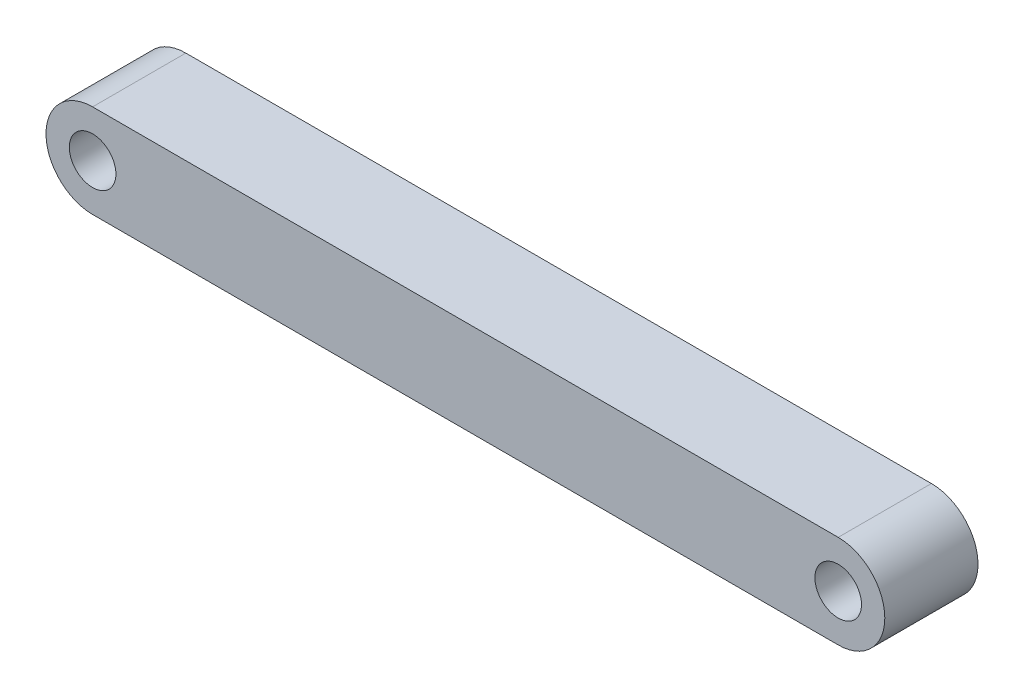
ISO-10303-21;
HEADER;
FILE_DESCRIPTION(('STEP AP214'),'2;1');
FILE_NAME('part.step','',(''),(''),'','','');
FILE_SCHEMA(('AUTOMOTIVE_DESIGN { 1 0 10303 214 1 1 1 1 }'));
ENDSEC;
DATA;
#1=APPLICATION_CONTEXT('core data for automotive mechanical design processes');
#2=APPLICATION_PROTOCOL_DEFINITION('international standard','automotive_design',2000,#1);
#3=PRODUCT_CONTEXT('',#1,'mechanical');
#4=PRODUCT('Part','Part','',(#3));
#5=PRODUCT_RELATED_PRODUCT_CATEGORY('part','',(#4));
#6=PRODUCT_DEFINITION_FORMATION('','',#4);
#7=PRODUCT_DEFINITION_CONTEXT('part definition',#1,'design');
#8=PRODUCT_DEFINITION('design','',#6,#7);
#9=PRODUCT_DEFINITION_SHAPE('','',#8);
#10=(LENGTH_UNIT() NAMED_UNIT(*) SI_UNIT(.MILLI.,.METRE.));
#11=(NAMED_UNIT(*) PLANE_ANGLE_UNIT() SI_UNIT($,.RADIAN.));
#12=(NAMED_UNIT(*) SI_UNIT($,.STERADIAN.) SOLID_ANGLE_UNIT());
#13=UNCERTAINTY_MEASURE_WITH_UNIT(LENGTH_MEASURE(1.E-05),#10,'distance_accuracy_value','');
#14=(GEOMETRIC_REPRESENTATION_CONTEXT(3) GLOBAL_UNCERTAINTY_ASSIGNED_CONTEXT((#13)) GLOBAL_UNIT_ASSIGNED_CONTEXT((#10,
#11,#12)) REPRESENTATION_CONTEXT('',''));
#15=CARTESIAN_POINT('',(0.,0.,0.));
#16=DIRECTION('',(0.,0.,1.));
#17=DIRECTION('',(1.,0.,0.));
#18=AXIS2_PLACEMENT_3D('',#15,#16,#17);
#19=CARTESIAN_POINT('',(-40.,0.,10.));
#20=DIRECTION('',(0.,0.,-1.));
#21=DIRECTION('',(-1.,0.,0.));
#22=AXIS2_PLACEMENT_3D('',#19,#20,#21);
#23=CYLINDRICAL_SURFACE('',#22,5.);
#24=CARTESIAN_POINT('',(-40.,0.,0.));
#25=DIRECTION('',(0.,0.,1.));
#26=DIRECTION('',(1.,0.,0.));
#27=AXIS2_PLACEMENT_3D('',#24,#25,#26);
#28=CIRCLE('',#27,5.);
#29=CARTESIAN_POINT('',(-40.,5.,0.));
#30=VERTEX_POINT('',#29);
#31=CARTESIAN_POINT('',(-40.,-5.,0.));
#32=VERTEX_POINT('',#31);
#33=EDGE_CURVE('E102',#30,#32,#28,.T.);
#34=ORIENTED_EDGE('',*,*,#33,.T.);
#35=DIRECTION('',(0.,0.,-1.));
#36=VECTOR('',#35,1.);
#37=CARTESIAN_POINT('',(-40.,-5.,10.));
#38=LINE('',#37,#36);
#39=CARTESIAN_POINT('',(-40.,-5.,10.));
#40=VERTEX_POINT('',#39);
#41=EDGE_CURVE('E11',#40,#32,#38,.T.);
#42=ORIENTED_EDGE('',*,*,#41,.F.);
#43=CARTESIAN_POINT('',(-40.,0.,10.));
#44=DIRECTION('',(0.,0.,1.));
#45=DIRECTION('',(1.,0.,0.));
#46=AXIS2_PLACEMENT_3D('',#43,#44,#45);
#47=CIRCLE('',#46,5.);
#48=CARTESIAN_POINT('',(-40.,5.,10.));
#49=VERTEX_POINT('',#48);
#50=EDGE_CURVE('E90',#49,#40,#47,.T.);
#51=ORIENTED_EDGE('',*,*,#50,.F.);
#52=DIRECTION('',(0.,0.,-1.));
#53=VECTOR('',#52,1.);
#54=CARTESIAN_POINT('',(-40.,5.,10.));
#55=LINE('',#54,#53);
#56=EDGE_CURVE('E98',#49,#30,#55,.T.);
#57=ORIENTED_EDGE('',*,*,#56,.T.);
#58=EDGE_LOOP('',(#34,#42,#51,#57));
#59=FACE_BOUND('',#58,.T.);
#60=ADVANCED_FACE('F39',(#59),#23,.T.);
#61=CARTESIAN_POINT('',(-40.,-5.,10.));
#62=DIRECTION('',(0.,1.,0.));
#63=DIRECTION('',(-1.,0.,0.));
#64=AXIS2_PLACEMENT_3D('',#61,#62,#63);
#65=PLANE('',#64);
#66=DIRECTION('',(1.,0.,0.));
#67=VECTOR('',#66,1.);
#68=CARTESIAN_POINT('',(-40.,-5.,0.));
#69=LINE('',#68,#67);
#70=CARTESIAN_POINT('',(40.,-4.99999999999999,0.));
#71=VERTEX_POINT('',#70);
#72=EDGE_CURVE('E94',#32,#71,#69,.T.);
#73=ORIENTED_EDGE('',*,*,#72,.T.);
#74=DIRECTION('',(0.,0.,-1.));
#75=VECTOR('',#74,1.);
#76=CARTESIAN_POINT('',(40.,-4.99999999999999,10.));
#77=LINE('',#76,#75);
#78=CARTESIAN_POINT('',(40.,-4.99999999999999,10.));
#79=VERTEX_POINT('',#78);
#80=EDGE_CURVE('E47',#79,#71,#77,.T.);
#81=ORIENTED_EDGE('',*,*,#80,.F.);
#82=DIRECTION('',(1.,0.,0.));
#83=VECTOR('',#82,1.);
#84=CARTESIAN_POINT('',(-40.,-5.,10.));
#85=LINE('',#84,#83);
#86=EDGE_CURVE('E85',#40,#79,#85,.T.);
#87=ORIENTED_EDGE('',*,*,#86,.F.);
#88=ORIENTED_EDGE('',*,*,#41,.T.);
#89=EDGE_LOOP('',(#73,#81,#87,#88));
#90=FACE_BOUND('',#89,.T.);
#91=ADVANCED_FACE('F93',(#90),#65,.F.);
#92=CARTESIAN_POINT('',(40.,0.,10.));
#93=DIRECTION('',(0.,0.,-1.));
#94=DIRECTION('',(-1.,0.,0.));
#95=AXIS2_PLACEMENT_3D('',#92,#93,#94);
#96=CYLINDRICAL_SURFACE('',#95,5.);
#97=CARTESIAN_POINT('',(40.,0.,0.));
#98=DIRECTION('',(0.,0.,1.));
#99=DIRECTION('',(1.,0.,0.));
#100=AXIS2_PLACEMENT_3D('',#97,#98,#99);
#101=CIRCLE('',#100,5.);
#102=CARTESIAN_POINT('',(40.,5.00000000000002,0.));
#103=VERTEX_POINT('',#102);
#104=EDGE_CURVE('E72',#71,#103,#101,.T.);
#105=ORIENTED_EDGE('',*,*,#104,.T.);
#106=DIRECTION('',(0.,0.,-1.));
#107=VECTOR('',#106,1.);
#108=CARTESIAN_POINT('',(40.,5.00000000000002,10.));
#109=LINE('',#108,#107);
#110=CARTESIAN_POINT('',(40.,5.00000000000002,10.));
#111=VERTEX_POINT('',#110);
#112=EDGE_CURVE('E95',#111,#103,#109,.T.);
#113=ORIENTED_EDGE('',*,*,#112,.F.);
#114=CARTESIAN_POINT('',(40.,0.,10.));
#115=DIRECTION('',(0.,0.,1.));
#116=DIRECTION('',(1.,0.,0.));
#117=AXIS2_PLACEMENT_3D('',#114,#115,#116);
#118=CIRCLE('',#117,5.);
#119=EDGE_CURVE('E88',#79,#111,#118,.T.);
#120=ORIENTED_EDGE('',*,*,#119,.F.);
#121=ORIENTED_EDGE('',*,*,#80,.T.);
#122=EDGE_LOOP('',(#105,#113,#120,#121));
#123=FACE_BOUND('',#122,.T.);
#124=ADVANCED_FACE('F96',(#123),#96,.T.);
#125=CARTESIAN_POINT('',(-40.,5.,10.));
#126=DIRECTION('',(0.,-1.,0.));
#127=DIRECTION('',(1.,0.,0.));
#128=AXIS2_PLACEMENT_3D('',#125,#126,#127);
#129=PLANE('',#128);
#130=DIRECTION('',(-1.,0.,0.));
#131=VECTOR('',#130,1.);
#132=CARTESIAN_POINT('',(-40.,5.,0.));
#133=LINE('',#132,#131);
#134=EDGE_CURVE('E78',#103,#30,#133,.T.);
#135=ORIENTED_EDGE('',*,*,#134,.T.);
#136=ORIENTED_EDGE('',*,*,#56,.F.);
#137=DIRECTION('',(-1.,0.,0.));
#138=VECTOR('',#137,1.);
#139=CARTESIAN_POINT('',(-40.,5.,10.));
#140=LINE('',#139,#138);
#141=EDGE_CURVE('E55',#111,#49,#140,.T.);
#142=ORIENTED_EDGE('',*,*,#141,.F.);
#143=ORIENTED_EDGE('',*,*,#112,.T.);
#144=EDGE_LOOP('',(#135,#136,#142,#143));
#145=FACE_BOUND('',#144,.T.);
#146=ADVANCED_FACE('F110',(#145),#129,.F.);
#147=CARTESIAN_POINT('',(-40.,0.,10.));
#148=DIRECTION('',(0.,0.,1.));
#149=DIRECTION('',(1.,0.,0.));
#150=AXIS2_PLACEMENT_3D('',#147,#148,#149);
#151=PLANE('',#150);
#152=CARTESIAN_POINT('',(-40.,0.,10.));
#153=DIRECTION('',(0.,0.,1.));
#154=DIRECTION('',(1.,0.,0.));
#155=AXIS2_PLACEMENT_3D('',#152,#153,#154);
#156=CIRCLE('',#155,2.5);
#157=CARTESIAN_POINT('',(-37.5,0.,10.));
#158=VERTEX_POINT('',#157);
#159=EDGE_CURVE('E122',#158,#158,#156,.T.);
#160=ORIENTED_EDGE('',*,*,#159,.F.);
#161=EDGE_LOOP('',(#160));
#162=FACE_BOUND('',#161,.T.);
#163=CARTESIAN_POINT('',(40.,0.,10.));
#164=DIRECTION('',(0.,0.,1.));
#165=DIRECTION('',(1.,0.,0.));
#166=AXIS2_PLACEMENT_3D('',#163,#164,#165);
#167=CIRCLE('',#166,2.5);
#168=CARTESIAN_POINT('',(42.5,0.,10.));
#169=VERTEX_POINT('',#168);
#170=EDGE_CURVE('E119',#169,#169,#167,.T.);
#171=ORIENTED_EDGE('',*,*,#170,.F.);
#172=EDGE_LOOP('',(#171));
#173=FACE_BOUND('',#172,.T.);
#174=ORIENTED_EDGE('',*,*,#50,.T.);
#175=ORIENTED_EDGE('',*,*,#86,.T.);
#176=ORIENTED_EDGE('',*,*,#119,.T.);
#177=ORIENTED_EDGE('',*,*,#141,.T.);
#178=EDGE_LOOP('',(#174,#175,#176,#177));
#179=FACE_BOUND('',#178,.T.);
#180=ADVANCED_FACE('F86',(#162,#173,#179),#151,.T.);
#181=CARTESIAN_POINT('',(-40.,0.,0.));
#182=DIRECTION('',(0.,0.,1.));
#183=DIRECTION('',(1.,0.,0.));
#184=AXIS2_PLACEMENT_3D('',#181,#182,#183);
#185=PLANE('',#184);
#186=CARTESIAN_POINT('',(-40.,0.,0.));
#187=DIRECTION('',(0.,0.,1.));
#188=DIRECTION('',(1.,0.,0.));
#189=AXIS2_PLACEMENT_3D('',#186,#187,#188);
#190=CIRCLE('',#189,2.5);
#191=CARTESIAN_POINT('',(-37.5,0.,0.));
#192=VERTEX_POINT('',#191);
#193=EDGE_CURVE('E105',#192,#192,#190,.T.);
#194=ORIENTED_EDGE('',*,*,#193,.T.);
#195=EDGE_LOOP('',(#194));
#196=FACE_BOUND('',#195,.T.);
#197=CARTESIAN_POINT('',(40.,0.,0.));
#198=DIRECTION('',(0.,0.,1.));
#199=DIRECTION('',(1.,0.,0.));
#200=AXIS2_PLACEMENT_3D('',#197,#198,#199);
#201=CIRCLE('',#200,2.5);
#202=CARTESIAN_POINT('',(42.5,0.,0.));
#203=VERTEX_POINT('',#202);
#204=EDGE_CURVE('E116',#203,#203,#201,.T.);
#205=ORIENTED_EDGE('',*,*,#204,.T.);
#206=EDGE_LOOP('',(#205));
#207=FACE_BOUND('',#206,.T.);
#208=ORIENTED_EDGE('',*,*,#33,.F.);
#209=ORIENTED_EDGE('',*,*,#134,.F.);
#210=ORIENTED_EDGE('',*,*,#104,.F.);
#211=ORIENTED_EDGE('',*,*,#72,.F.);
#212=EDGE_LOOP('',(#208,#209,#210,#211));
#213=FACE_BOUND('',#212,.T.);
#214=ADVANCED_FACE('F113',(#196,#207,#213),#185,.F.);
#215=CARTESIAN_POINT('',(40.,0.,0.));
#216=DIRECTION('',(0.,0.,1.));
#217=DIRECTION('',(1.,0.,0.));
#218=AXIS2_PLACEMENT_3D('',#215,#216,#217);
#219=CYLINDRICAL_SURFACE('',#218,2.5);
#220=ORIENTED_EDGE('',*,*,#204,.F.);
#221=EDGE_LOOP('',(#220));
#222=FACE_BOUND('',#221,.T.);
#223=ORIENTED_EDGE('',*,*,#170,.T.);
#224=EDGE_LOOP('',(#223));
#225=FACE_BOUND('',#224,.T.);
#226=ADVANCED_FACE('F133',(#222,#225),#219,.F.);
#227=CARTESIAN_POINT('',(-40.,0.,0.));
#228=DIRECTION('',(0.,0.,1.));
#229=DIRECTION('',(1.,0.,0.));
#230=AXIS2_PLACEMENT_3D('',#227,#228,#229);
#231=CYLINDRICAL_SURFACE('',#230,2.5);
#232=ORIENTED_EDGE('',*,*,#193,.F.);
#233=EDGE_LOOP('',(#232));
#234=FACE_BOUND('',#233,.T.);
#235=ORIENTED_EDGE('',*,*,#159,.T.);
#236=EDGE_LOOP('',(#235));
#237=FACE_BOUND('',#236,.T.);
#238=ADVANCED_FACE('F130',(#234,#237),#231,.F.);
#239=CLOSED_SHELL('',(#60,#91,#124,#146,#180,#214,#226,#238));
#240=MANIFOLD_SOLID_BREP('B2',#239);
#241=ADVANCED_BREP_SHAPE_REPRESENTATION('',(#18,#240),#14);
#242=SHAPE_DEFINITION_REPRESENTATION(#9,#241);
ENDSEC;
END-ISO-10303-21;
